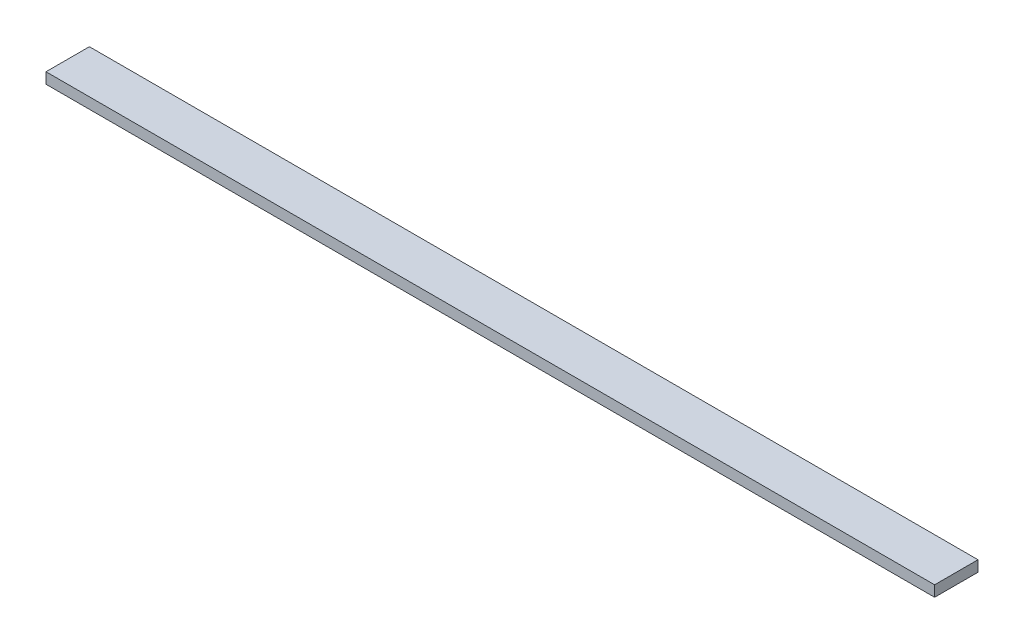
ISO-10303-21;
HEADER;
FILE_DESCRIPTION(('STEP AP214'),'2;1');
FILE_NAME('part.step','',(''),(''),'','','');
FILE_SCHEMA(('AUTOMOTIVE_DESIGN { 1 0 10303 214 1 1 1 1 }'));
ENDSEC;
DATA;
#1=APPLICATION_CONTEXT('core data for automotive mechanical design processes');
#2=APPLICATION_PROTOCOL_DEFINITION('international standard','automotive_design',2000,#1);
#3=PRODUCT_CONTEXT('',#1,'mechanical');
#4=PRODUCT('Part','Part','',(#3));
#5=PRODUCT_RELATED_PRODUCT_CATEGORY('part','',(#4));
#6=PRODUCT_DEFINITION_FORMATION('','',#4);
#7=PRODUCT_DEFINITION_CONTEXT('part definition',#1,'design');
#8=PRODUCT_DEFINITION('design','',#6,#7);
#9=PRODUCT_DEFINITION_SHAPE('','',#8);
#10=(LENGTH_UNIT() NAMED_UNIT(*) SI_UNIT(.MILLI.,.METRE.));
#11=(NAMED_UNIT(*) PLANE_ANGLE_UNIT() SI_UNIT($,.RADIAN.));
#12=(NAMED_UNIT(*) SI_UNIT($,.STERADIAN.) SOLID_ANGLE_UNIT());
#13=UNCERTAINTY_MEASURE_WITH_UNIT(LENGTH_MEASURE(1.E-05),#10,'distance_accuracy_value','');
#14=(GEOMETRIC_REPRESENTATION_CONTEXT(3) GLOBAL_UNCERTAINTY_ASSIGNED_CONTEXT((#13)) GLOBAL_UNIT_ASSIGNED_CONTEXT((#10,
#11,#12)) REPRESENTATION_CONTEXT('',''));
#15=CARTESIAN_POINT('',(0.,0.,0.));
#16=DIRECTION('',(0.,0.,1.));
#17=DIRECTION('',(1.,0.,0.));
#18=AXIS2_PLACEMENT_3D('',#15,#16,#17);
#19=CARTESIAN_POINT('',(0.,3.175,0.));
#20=DIRECTION('',(1.,0.,0.));
#21=DIRECTION('',(0.,0.,-1.));
#22=AXIS2_PLACEMENT_3D('',#19,#20,#21);
#23=PLANE('',#22);
#24=DIRECTION('',(0.,0.,1.));
#25=VECTOR('',#24,1.);
#26=CARTESIAN_POINT('',(0.,0.,0.));
#27=LINE('',#26,#25);
#28=CARTESIAN_POINT('',(0.,0.,-12.7));
#29=VERTEX_POINT('',#28);
#30=CARTESIAN_POINT('',(0.,0.,0.));
#31=VERTEX_POINT('',#30);
#32=EDGE_CURVE('E100',#29,#31,#27,.T.);
#33=ORIENTED_EDGE('',*,*,#32,.T.);
#34=DIRECTION('',(0.,-1.,0.));
#35=VECTOR('',#34,1.);
#36=CARTESIAN_POINT('',(0.,3.175,0.));
#37=LINE('',#36,#35);
#38=CARTESIAN_POINT('',(0.,3.175,0.));
#39=VERTEX_POINT('',#38);
#40=EDGE_CURVE('E11',#39,#31,#37,.T.);
#41=ORIENTED_EDGE('',*,*,#40,.F.);
#42=DIRECTION('',(0.,0.,1.));
#43=VECTOR('',#42,1.);
#44=CARTESIAN_POINT('',(0.,3.175,0.));
#45=LINE('',#44,#43);
#46=CARTESIAN_POINT('',(0.,3.175,-12.7));
#47=VERTEX_POINT('',#46);
#48=EDGE_CURVE('E88',#47,#39,#45,.T.);
#49=ORIENTED_EDGE('',*,*,#48,.F.);
#50=DIRECTION('',(0.,-1.,0.));
#51=VECTOR('',#50,1.);
#52=CARTESIAN_POINT('',(0.,3.175,-12.7));
#53=LINE('',#52,#51);
#54=EDGE_CURVE('E96',#47,#29,#53,.T.);
#55=ORIENTED_EDGE('',*,*,#54,.T.);
#56=EDGE_LOOP('',(#33,#41,#49,#55));
#57=FACE_BOUND('',#56,.T.);
#58=ADVANCED_FACE('F37',(#57),#23,.F.);
#59=CARTESIAN_POINT('',(0.,3.175,0.));
#60=DIRECTION('',(0.,0.,-1.));
#61=DIRECTION('',(-1.,0.,0.));
#62=AXIS2_PLACEMENT_3D('',#59,#60,#61);
#63=PLANE('',#62);
#64=DIRECTION('',(1.,0.,0.));
#65=VECTOR('',#64,1.);
#66=CARTESIAN_POINT('',(0.,0.,0.));
#67=LINE('',#66,#65);
#68=CARTESIAN_POINT('',(260.096,0.,0.));
#69=VERTEX_POINT('',#68);
#70=EDGE_CURVE('E92',#31,#69,#67,.T.);
#71=ORIENTED_EDGE('',*,*,#70,.T.);
#72=DIRECTION('',(0.,-1.,0.));
#73=VECTOR('',#72,1.);
#74=CARTESIAN_POINT('',(260.096,3.175,0.));
#75=LINE('',#74,#73);
#76=CARTESIAN_POINT('',(260.096,3.175,0.));
#77=VERTEX_POINT('',#76);
#78=EDGE_CURVE('E45',#77,#69,#75,.T.);
#79=ORIENTED_EDGE('',*,*,#78,.F.);
#80=DIRECTION('',(1.,0.,0.));
#81=VECTOR('',#80,1.);
#82=CARTESIAN_POINT('',(0.,3.175,0.));
#83=LINE('',#82,#81);
#84=EDGE_CURVE('E83',#39,#77,#83,.T.);
#85=ORIENTED_EDGE('',*,*,#84,.F.);
#86=ORIENTED_EDGE('',*,*,#40,.T.);
#87=EDGE_LOOP('',(#71,#79,#85,#86));
#88=FACE_BOUND('',#87,.T.);
#89=ADVANCED_FACE('F91',(#88),#63,.F.);
#90=CARTESIAN_POINT('',(260.096,3.175,0.));
#91=DIRECTION('',(-1.,0.,0.));
#92=DIRECTION('',(0.,0.,1.));
#93=AXIS2_PLACEMENT_3D('',#90,#91,#92);
#94=PLANE('',#93);
#95=DIRECTION('',(0.,0.,-1.));
#96=VECTOR('',#95,1.);
#97=CARTESIAN_POINT('',(260.096,0.,0.));
#98=LINE('',#97,#96);
#99=CARTESIAN_POINT('',(260.096,0.,-12.7));
#100=VERTEX_POINT('',#99);
#101=EDGE_CURVE('E70',#69,#100,#98,.T.);
#102=ORIENTED_EDGE('',*,*,#101,.T.);
#103=DIRECTION('',(0.,-1.,0.));
#104=VECTOR('',#103,1.);
#105=CARTESIAN_POINT('',(260.096,3.175,-12.7));
#106=LINE('',#105,#104);
#107=CARTESIAN_POINT('',(260.096,3.175,-12.7));
#108=VERTEX_POINT('',#107);
#109=EDGE_CURVE('E93',#108,#100,#106,.T.);
#110=ORIENTED_EDGE('',*,*,#109,.F.);
#111=DIRECTION('',(0.,0.,-1.));
#112=VECTOR('',#111,1.);
#113=CARTESIAN_POINT('',(260.096,3.175,0.));
#114=LINE('',#113,#112);
#115=EDGE_CURVE('E86',#77,#108,#114,.T.);
#116=ORIENTED_EDGE('',*,*,#115,.F.);
#117=ORIENTED_EDGE('',*,*,#78,.T.);
#118=EDGE_LOOP('',(#102,#110,#116,#117));
#119=FACE_BOUND('',#118,.T.);
#120=ADVANCED_FACE('F94',(#119),#94,.F.);
#121=CARTESIAN_POINT('',(0.,3.175,-12.7));
#122=DIRECTION('',(0.,0.,1.));
#123=DIRECTION('',(1.,0.,0.));
#124=AXIS2_PLACEMENT_3D('',#121,#122,#123);
#125=PLANE('',#124);
#126=DIRECTION('',(-1.,0.,0.));
#127=VECTOR('',#126,1.);
#128=CARTESIAN_POINT('',(0.,0.,-12.7));
#129=LINE('',#128,#127);
#130=EDGE_CURVE('E76',#100,#29,#129,.T.);
#131=ORIENTED_EDGE('',*,*,#130,.T.);
#132=ORIENTED_EDGE('',*,*,#54,.F.);
#133=DIRECTION('',(-1.,0.,0.));
#134=VECTOR('',#133,1.);
#135=CARTESIAN_POINT('',(0.,3.175,-12.7));
#136=LINE('',#135,#134);
#137=EDGE_CURVE('E53',#108,#47,#136,.T.);
#138=ORIENTED_EDGE('',*,*,#137,.F.);
#139=ORIENTED_EDGE('',*,*,#109,.T.);
#140=EDGE_LOOP('',(#131,#132,#138,#139));
#141=FACE_BOUND('',#140,.T.);
#142=ADVANCED_FACE('F107',(#141),#125,.F.);
#143=CARTESIAN_POINT('',(0.,3.175,0.));
#144=DIRECTION('',(0.,-1.,0.));
#145=DIRECTION('',(0.,0.,-1.));
#146=AXIS2_PLACEMENT_3D('',#143,#144,#145);
#147=PLANE('',#146);
#148=ORIENTED_EDGE('',*,*,#48,.T.);
#149=ORIENTED_EDGE('',*,*,#84,.T.);
#150=ORIENTED_EDGE('',*,*,#115,.T.);
#151=ORIENTED_EDGE('',*,*,#137,.T.);
#152=EDGE_LOOP('',(#148,#149,#150,#151));
#153=FACE_BOUND('',#152,.T.);
#154=ADVANCED_FACE('F84',(#153),#147,.F.);
#155=CARTESIAN_POINT('',(0.,0.,0.));
#156=DIRECTION('',(0.,-1.,0.));
#157=DIRECTION('',(0.,0.,-1.));
#158=AXIS2_PLACEMENT_3D('',#155,#156,#157);
#159=PLANE('',#158);
#160=ORIENTED_EDGE('',*,*,#32,.F.);
#161=ORIENTED_EDGE('',*,*,#130,.F.);
#162=ORIENTED_EDGE('',*,*,#101,.F.);
#163=ORIENTED_EDGE('',*,*,#70,.F.);
#164=EDGE_LOOP('',(#160,#161,#162,#163));
#165=FACE_BOUND('',#164,.T.);
#166=ADVANCED_FACE('F110',(#165),#159,.T.);
#167=CLOSED_SHELL('',(#58,#89,#120,#142,#154,#166));
#168=MANIFOLD_SOLID_BREP('B2',#167);
#169=ADVANCED_BREP_SHAPE_REPRESENTATION('',(#18,#168),#14);
#170=SHAPE_DEFINITION_REPRESENTATION(#9,#169);
ENDSEC;
END-ISO-10303-21;
